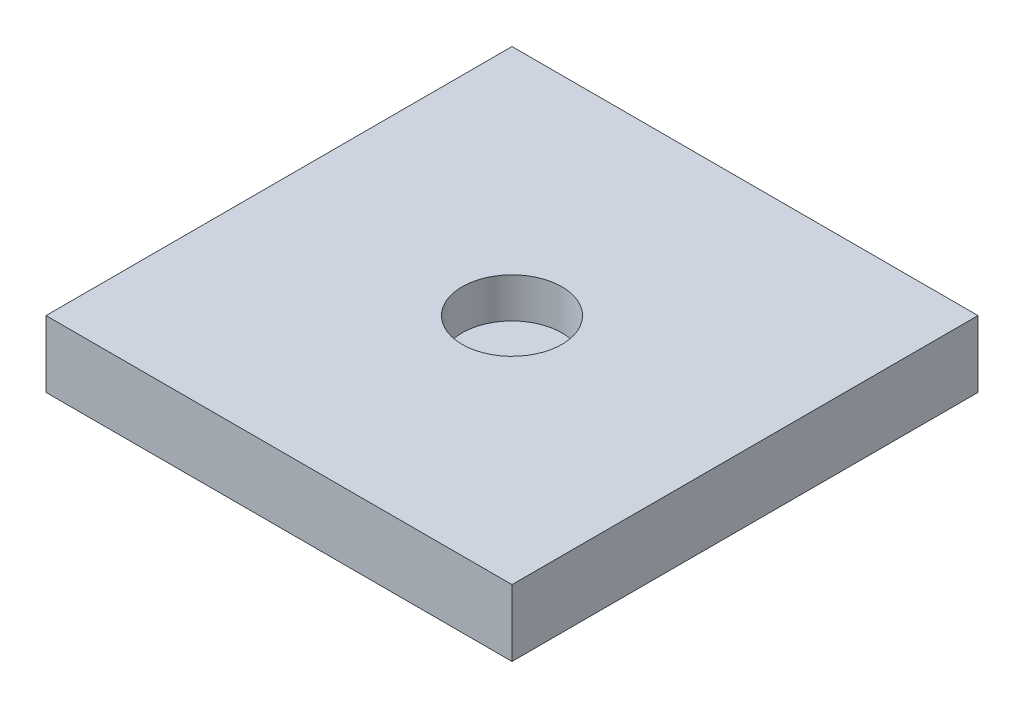
ISO-10303-21;
HEADER;
FILE_DESCRIPTION(('STEP AP214'),'2;1');
FILE_NAME('part.step','',(''),(''),'','','');
FILE_SCHEMA(('AUTOMOTIVE_DESIGN { 1 0 10303 214 1 1 1 1 }'));
ENDSEC;
DATA;
#1=APPLICATION_CONTEXT('core data for automotive mechanical design processes');
#2=APPLICATION_PROTOCOL_DEFINITION('international standard','automotive_design',2000,#1);
#3=PRODUCT_CONTEXT('',#1,'mechanical');
#4=PRODUCT('Part','Part','',(#3));
#5=PRODUCT_RELATED_PRODUCT_CATEGORY('part','',(#4));
#6=PRODUCT_DEFINITION_FORMATION('','',#4);
#7=PRODUCT_DEFINITION_CONTEXT('part definition',#1,'design');
#8=PRODUCT_DEFINITION('design','',#6,#7);
#9=PRODUCT_DEFINITION_SHAPE('','',#8);
#10=(LENGTH_UNIT() NAMED_UNIT(*) SI_UNIT(.MILLI.,.METRE.));
#11=(NAMED_UNIT(*) PLANE_ANGLE_UNIT() SI_UNIT($,.RADIAN.));
#12=(NAMED_UNIT(*) SI_UNIT($,.STERADIAN.) SOLID_ANGLE_UNIT());
#13=UNCERTAINTY_MEASURE_WITH_UNIT(LENGTH_MEASURE(1.E-05),#10,'distance_accuracy_value','');
#14=(GEOMETRIC_REPRESENTATION_CONTEXT(3) GLOBAL_UNCERTAINTY_ASSIGNED_CONTEXT((#13)) GLOBAL_UNIT_ASSIGNED_CONTEXT((#10,
#11,#12)) REPRESENTATION_CONTEXT('',''));
#15=CARTESIAN_POINT('',(0.,0.,0.));
#16=DIRECTION('',(0.,0.,1.));
#17=DIRECTION('',(1.,0.,0.));
#18=AXIS2_PLACEMENT_3D('',#15,#16,#17);
#19=CARTESIAN_POINT('',(17.5,5.,-17.5));
#20=DIRECTION('',(-1.,0.,0.));
#21=DIRECTION('',(0.,0.,1.));
#22=AXIS2_PLACEMENT_3D('',#19,#20,#21);
#23=PLANE('',#22);
#24=DIRECTION('',(0.,0.,-1.));
#25=VECTOR('',#24,1.);
#26=CARTESIAN_POINT('',(17.5,0.,-17.5));
#27=LINE('',#26,#25);
#28=CARTESIAN_POINT('',(17.5,0.,17.5));
#29=VERTEX_POINT('',#28);
#30=CARTESIAN_POINT('',(17.5,0.,-17.5));
#31=VERTEX_POINT('',#30);
#32=EDGE_CURVE('E104',#29,#31,#27,.T.);
#33=ORIENTED_EDGE('',*,*,#32,.T.);
#34=DIRECTION('',(0.,-1.,0.));
#35=VECTOR('',#34,1.);
#36=CARTESIAN_POINT('',(17.5,5.,-17.5));
#37=LINE('',#36,#35);
#38=CARTESIAN_POINT('',(17.5,5.,-17.5));
#39=VERTEX_POINT('',#38);
#40=EDGE_CURVE('E11',#39,#31,#37,.T.);
#41=ORIENTED_EDGE('',*,*,#40,.F.);
#42=DIRECTION('',(0.,0.,-1.));
#43=VECTOR('',#42,1.);
#44=CARTESIAN_POINT('',(17.5,5.,-17.5));
#45=LINE('',#44,#43);
#46=CARTESIAN_POINT('',(17.5,5.,17.5));
#47=VERTEX_POINT('',#46);
#48=EDGE_CURVE('E92',#47,#39,#45,.T.);
#49=ORIENTED_EDGE('',*,*,#48,.F.);
#50=DIRECTION('',(0.,-1.,0.));
#51=VECTOR('',#50,1.);
#52=CARTESIAN_POINT('',(17.5,5.,17.5));
#53=LINE('',#52,#51);
#54=EDGE_CURVE('E100',#47,#29,#53,.T.);
#55=ORIENTED_EDGE('',*,*,#54,.T.);
#56=EDGE_LOOP('',(#33,#41,#49,#55));
#57=FACE_BOUND('',#56,.T.);
#58=ADVANCED_FACE('F41',(#57),#23,.F.);
#59=CARTESIAN_POINT('',(-17.5,5.,-17.5));
#60=DIRECTION('',(0.,0.,1.));
#61=DIRECTION('',(1.,0.,0.));
#62=AXIS2_PLACEMENT_3D('',#59,#60,#61);
#63=PLANE('',#62);
#64=DIRECTION('',(-1.,0.,0.));
#65=VECTOR('',#64,1.);
#66=CARTESIAN_POINT('',(-17.5,0.,-17.5));
#67=LINE('',#66,#65);
#68=CARTESIAN_POINT('',(-17.5,0.,-17.5));
#69=VERTEX_POINT('',#68);
#70=EDGE_CURVE('E96',#31,#69,#67,.T.);
#71=ORIENTED_EDGE('',*,*,#70,.T.);
#72=DIRECTION('',(0.,-1.,0.));
#73=VECTOR('',#72,1.);
#74=CARTESIAN_POINT('',(-17.5,5.,-17.5));
#75=LINE('',#74,#73);
#76=CARTESIAN_POINT('',(-17.5,5.,-17.5));
#77=VERTEX_POINT('',#76);
#78=EDGE_CURVE('E49',#77,#69,#75,.T.);
#79=ORIENTED_EDGE('',*,*,#78,.F.);
#80=DIRECTION('',(-1.,0.,0.));
#81=VECTOR('',#80,1.);
#82=CARTESIAN_POINT('',(-17.5,5.,-17.5));
#83=LINE('',#82,#81);
#84=EDGE_CURVE('E87',#39,#77,#83,.T.);
#85=ORIENTED_EDGE('',*,*,#84,.F.);
#86=ORIENTED_EDGE('',*,*,#40,.T.);
#87=EDGE_LOOP('',(#71,#79,#85,#86));
#88=FACE_BOUND('',#87,.T.);
#89=ADVANCED_FACE('F95',(#88),#63,.F.);
#90=CARTESIAN_POINT('',(-17.5,5.,-17.5));
#91=DIRECTION('',(1.,0.,0.));
#92=DIRECTION('',(0.,0.,-1.));
#93=AXIS2_PLACEMENT_3D('',#90,#91,#92);
#94=PLANE('',#93);
#95=DIRECTION('',(0.,0.,1.));
#96=VECTOR('',#95,1.);
#97=CARTESIAN_POINT('',(-17.5,0.,-17.5));
#98=LINE('',#97,#96);
#99=CARTESIAN_POINT('',(-17.5,0.,17.5));
#100=VERTEX_POINT('',#99);
#101=EDGE_CURVE('E74',#69,#100,#98,.T.);
#102=ORIENTED_EDGE('',*,*,#101,.T.);
#103=DIRECTION('',(0.,-1.,0.));
#104=VECTOR('',#103,1.);
#105=CARTESIAN_POINT('',(-17.5,5.,17.5));
#106=LINE('',#105,#104);
#107=CARTESIAN_POINT('',(-17.5,5.,17.5));
#108=VERTEX_POINT('',#107);
#109=EDGE_CURVE('E97',#108,#100,#106,.T.);
#110=ORIENTED_EDGE('',*,*,#109,.F.);
#111=DIRECTION('',(0.,0.,1.));
#112=VECTOR('',#111,1.);
#113=CARTESIAN_POINT('',(-17.5,5.,-17.5));
#114=LINE('',#113,#112);
#115=EDGE_CURVE('E90',#77,#108,#114,.T.);
#116=ORIENTED_EDGE('',*,*,#115,.F.);
#117=ORIENTED_EDGE('',*,*,#78,.T.);
#118=EDGE_LOOP('',(#102,#110,#116,#117));
#119=FACE_BOUND('',#118,.T.);
#120=ADVANCED_FACE('F98',(#119),#94,.F.);
#121=CARTESIAN_POINT('',(-17.5,5.,17.5));
#122=DIRECTION('',(0.,0.,-1.));
#123=DIRECTION('',(-1.,0.,0.));
#124=AXIS2_PLACEMENT_3D('',#121,#122,#123);
#125=PLANE('',#124);
#126=DIRECTION('',(1.,0.,0.));
#127=VECTOR('',#126,1.);
#128=CARTESIAN_POINT('',(-17.5,0.,17.5));
#129=LINE('',#128,#127);
#130=EDGE_CURVE('E80',#100,#29,#129,.T.);
#131=ORIENTED_EDGE('',*,*,#130,.T.);
#132=ORIENTED_EDGE('',*,*,#54,.F.);
#133=DIRECTION('',(1.,0.,0.));
#134=VECTOR('',#133,1.);
#135=CARTESIAN_POINT('',(-17.5,5.,17.5));
#136=LINE('',#135,#134);
#137=EDGE_CURVE('E57',#108,#47,#136,.T.);
#138=ORIENTED_EDGE('',*,*,#137,.F.);
#139=ORIENTED_EDGE('',*,*,#109,.T.);
#140=EDGE_LOOP('',(#131,#132,#138,#139));
#141=FACE_BOUND('',#140,.T.);
#142=ADVANCED_FACE('F112',(#141),#125,.F.);
#143=CARTESIAN_POINT('',(0.,5.,0.));
#144=DIRECTION('',(0.,1.,0.));
#145=DIRECTION('',(0.,0.,1.));
#146=AXIS2_PLACEMENT_3D('',#143,#144,#145);
#147=PLANE('',#146);
#148=CARTESIAN_POINT('',(0.,5.,0.));
#149=DIRECTION('',(0.,1.,0.));
#150=DIRECTION('',(0.,0.,1.));
#151=AXIS2_PLACEMENT_3D('',#148,#149,#150);
#152=CIRCLE('',#151,3.75);
#153=CARTESIAN_POINT('',(0.,5.,3.75));
#154=VERTEX_POINT('',#153);
#155=EDGE_CURVE('E118',#154,#154,#152,.T.);
#156=ORIENTED_EDGE('',*,*,#155,.F.);
#157=EDGE_LOOP('',(#156));
#158=FACE_BOUND('',#157,.T.);
#159=ORIENTED_EDGE('',*,*,#48,.T.);
#160=ORIENTED_EDGE('',*,*,#84,.T.);
#161=ORIENTED_EDGE('',*,*,#115,.T.);
#162=ORIENTED_EDGE('',*,*,#137,.T.);
#163=EDGE_LOOP('',(#159,#160,#161,#162));
#164=FACE_BOUND('',#163,.T.);
#165=ADVANCED_FACE('F88',(#158,#164),#147,.T.);
#166=CARTESIAN_POINT('',(0.,0.,0.));
#167=DIRECTION('',(0.,1.,0.));
#168=DIRECTION('',(0.,0.,1.));
#169=AXIS2_PLACEMENT_3D('',#166,#167,#168);
#170=PLANE('',#169);
#171=ORIENTED_EDGE('',*,*,#32,.F.);
#172=ORIENTED_EDGE('',*,*,#130,.F.);
#173=ORIENTED_EDGE('',*,*,#101,.F.);
#174=ORIENTED_EDGE('',*,*,#70,.F.);
#175=EDGE_LOOP('',(#171,#172,#173,#174));
#176=FACE_BOUND('',#175,.T.);
#177=ADVANCED_FACE('F115',(#176),#170,.F.);
#178=CARTESIAN_POINT('',(0.,2.,0.));
#179=DIRECTION('',(0.,1.,0.));
#180=DIRECTION('',(0.,0.,1.));
#181=AXIS2_PLACEMENT_3D('',#178,#179,#180);
#182=CYLINDRICAL_SURFACE('',#181,3.75);
#183=CARTESIAN_POINT('',(0.,2.,0.));
#184=DIRECTION('',(0.,1.,0.));
#185=DIRECTION('',(0.,0.,1.));
#186=AXIS2_PLACEMENT_3D('',#183,#184,#185);
#187=CIRCLE('',#186,3.75);
#188=CARTESIAN_POINT('',(0.,2.,3.75));
#189=VERTEX_POINT('',#188);
#190=EDGE_CURVE('E107',#189,#189,#187,.T.);
#191=ORIENTED_EDGE('',*,*,#190,.F.);
#192=EDGE_LOOP('',(#191));
#193=FACE_BOUND('',#192,.T.);
#194=ORIENTED_EDGE('',*,*,#155,.T.);
#195=EDGE_LOOP('',(#194));
#196=FACE_BOUND('',#195,.T.);
#197=ADVANCED_FACE('F126',(#193,#196),#182,.F.);
#198=CARTESIAN_POINT('',(0.,2.,0.));
#199=DIRECTION('',(0.,1.,0.));
#200=DIRECTION('',(0.,0.,1.));
#201=AXIS2_PLACEMENT_3D('',#198,#199,#200);
#202=PLANE('',#201);
#203=ORIENTED_EDGE('',*,*,#190,.T.);
#204=EDGE_LOOP('',(#203));
#205=FACE_BOUND('',#204,.T.);
#206=ADVANCED_FACE('F124',(#205),#202,.T.);
#207=CLOSED_SHELL('',(#58,#89,#120,#142,#165,#177,#197,#206));
#208=MANIFOLD_SOLID_BREP('B2',#207);
#209=ADVANCED_BREP_SHAPE_REPRESENTATION('',(#18,#208),#14);
#210=SHAPE_DEFINITION_REPRESENTATION(#9,#209);
ENDSEC;
END-ISO-10303-21;
